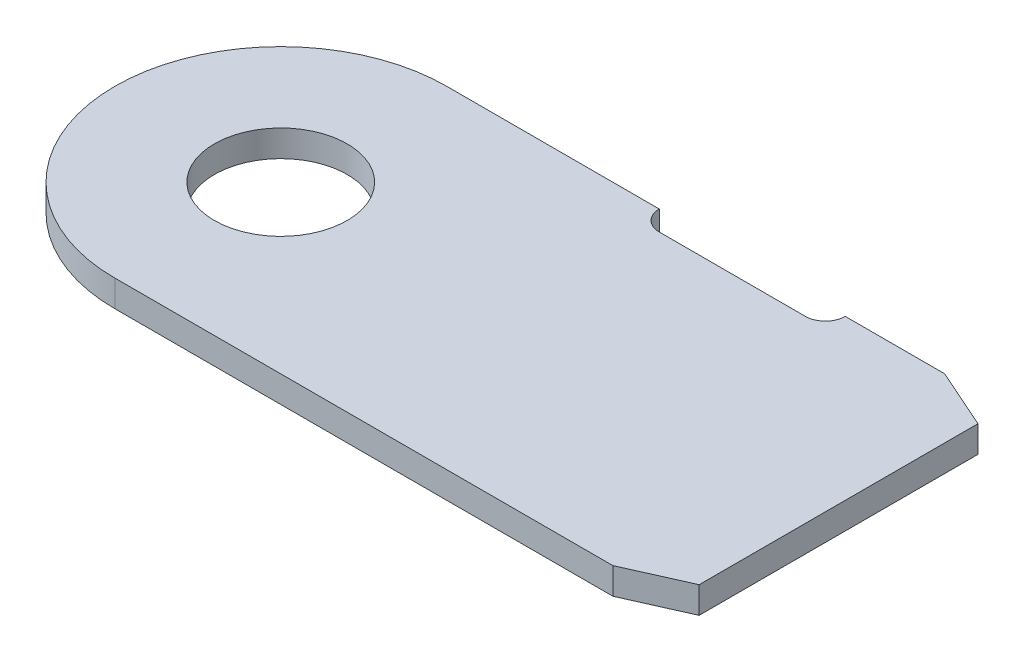
ISO-10303-21;
HEADER;
FILE_DESCRIPTION(('STEP AP214'),'2;1');
FILE_NAME('part.step','',(''),(''),'','','');
FILE_SCHEMA(('AUTOMOTIVE_DESIGN { 1 0 10303 214 1 1 1 1 }'));
ENDSEC;
DATA;
#1=APPLICATION_CONTEXT('core data for automotive mechanical design processes');
#2=APPLICATION_PROTOCOL_DEFINITION('international standard','automotive_design',2000,#1);
#3=PRODUCT_CONTEXT('',#1,'mechanical');
#4=PRODUCT('Part','Part','',(#3));
#5=PRODUCT_RELATED_PRODUCT_CATEGORY('part','',(#4));
#6=PRODUCT_DEFINITION_FORMATION('','',#4);
#7=PRODUCT_DEFINITION_CONTEXT('part definition',#1,'design');
#8=PRODUCT_DEFINITION('design','',#6,#7);
#9=PRODUCT_DEFINITION_SHAPE('','',#8);
#10=(LENGTH_UNIT() NAMED_UNIT(*) SI_UNIT(.MILLI.,.METRE.));
#11=(NAMED_UNIT(*) PLANE_ANGLE_UNIT() SI_UNIT($,.RADIAN.));
#12=(NAMED_UNIT(*) SI_UNIT($,.STERADIAN.) SOLID_ANGLE_UNIT());
#13=UNCERTAINTY_MEASURE_WITH_UNIT(LENGTH_MEASURE(1.E-05),#10,'distance_accuracy_value','');
#14=(GEOMETRIC_REPRESENTATION_CONTEXT(3) GLOBAL_UNCERTAINTY_ASSIGNED_CONTEXT((#13)) GLOBAL_UNIT_ASSIGNED_CONTEXT((#10,
#11,#12)) REPRESENTATION_CONTEXT('',''));
#15=CARTESIAN_POINT('',(0.,0.,0.));
#16=DIRECTION('',(0.,0.,1.));
#17=DIRECTION('',(1.,0.,0.));
#18=AXIS2_PLACEMENT_3D('',#15,#16,#17);
#19=CARTESIAN_POINT('',(-27.25,1.,-12.5));
#20=DIRECTION('',(0.,0.,1.));
#21=DIRECTION('',(1.,0.,0.));
#22=AXIS2_PLACEMENT_3D('',#19,#20,#21);
#23=PLANE('',#22);
#24=DIRECTION('',(0.,1.,0.));
#25=VECTOR('',#24,1.);
#26=CARTESIAN_POINT('',(15.25,-1.,-12.5));
#27=LINE('',#26,#25);
#28=CARTESIAN_POINT('',(15.25,-1.,-12.5));
#29=VERTEX_POINT('',#28);
#30=CARTESIAN_POINT('',(15.25,1.,-12.5));
#31=VERTEX_POINT('',#30);
#32=EDGE_CURVE('E175',#29,#31,#27,.T.);
#33=ORIENTED_EDGE('',*,*,#32,.T.);
#34=DIRECTION('',(-1.,0.,0.));
#35=VECTOR('',#34,1.);
#36=CARTESIAN_POINT('',(-27.25,1.,-12.5));
#37=LINE('',#36,#35);
#38=CARTESIAN_POINT('',(22.75,1.,-12.5));
#39=VERTEX_POINT('',#38);
#40=EDGE_CURVE('E241',#39,#31,#37,.T.);
#41=ORIENTED_EDGE('',*,*,#40,.F.);
#42=CARTESIAN_POINT('',(22.75,-1.2,-12.5));
#43=CARTESIAN_POINT('',(22.75,-0.4,-12.5));
#44=CARTESIAN_POINT('',(22.75,0.399999999999999,-12.5));
#45=CARTESIAN_POINT('',(22.75,1.2,-12.5));
#46=B_SPLINE_CURVE_WITH_KNOTS('',3,(#42,#43,#44,#45),.UNSPECIFIED.,.F.,.F.,(4,4),(-0.0022,
0.0002),.UNSPECIFIED.);
#47=CARTESIAN_POINT('',(22.75,-1.,-12.5));
#48=VERTEX_POINT('',#47);
#49=EDGE_CURVE('E488',#39,#48,#46,.F.);
#50=ORIENTED_EDGE('',*,*,#49,.T.);
#51=DIRECTION('',(-1.,0.,0.));
#52=VECTOR('',#51,1.);
#53=CARTESIAN_POINT('',(-27.25,-1.,-12.5));
#54=LINE('',#53,#52);
#55=EDGE_CURVE('E232',#48,#29,#54,.T.);
#56=ORIENTED_EDGE('',*,*,#55,.T.);
#57=EDGE_LOOP('',(#33,#41,#50,#56));
#58=FACE_BOUND('',#57,.T.);
#59=ADVANCED_FACE('F48',(#58),#23,.F.);
#60=CARTESIAN_POINT('',(27.25,1.2,10.5));
#61=CARTESIAN_POINT('',(27.25,0.4,10.5));
#62=CARTESIAN_POINT('',(27.25,-0.4,10.5));
#63=CARTESIAN_POINT('',(27.25,-1.2,10.5));
#64=CARTESIAN_POINT('',(22.75,1.2,12.5));
#65=CARTESIAN_POINT('',(22.75,0.4,12.5));
#66=CARTESIAN_POINT('',(22.75,-0.4,12.5));
#67=CARTESIAN_POINT('',(22.75,-1.2,12.5));
#68=B_SPLINE_SURFACE_WITH_KNOTS('',1,3,((#60,#61,#62,#63),(#64,#65,#66,#67)),.UNSPECIFIED.,.F.,
.F.,.F.,(2,2),(4,4),(0.,1.),(-0.0002,0.0022),.UNSPECIFIED.);
#69=CARTESIAN_POINT('',(27.25,-1.2,10.5));
#70=CARTESIAN_POINT('',(27.25,-0.4,10.5));
#71=CARTESIAN_POINT('',(27.25,0.4,10.5));
#72=CARTESIAN_POINT('',(27.25,1.2,10.5));
#73=B_SPLINE_CURVE_WITH_KNOTS('',3,(#69,#70,#71,#72),.UNSPECIFIED.,.F.,.F.,(4,4),(-0.0002,
0.0022),.UNSPECIFIED.);
#74=CARTESIAN_POINT('',(27.25,1.,10.5));
#75=VERTEX_POINT('',#74);
#76=CARTESIAN_POINT('',(27.25,-1.,10.5));
#77=VERTEX_POINT('',#76);
#78=EDGE_CURVE('E202',#75,#77,#73,.F.);
#79=CARTESIAN_POINT('',(27.25,1.,10.5));
#80=CARTESIAN_POINT('',(22.75,1.,12.5));
#81=B_SPLINE_CURVE_WITH_KNOTS('',1,(#79,#80),.UNSPECIFIED.,.F.,.F.,(2,2),(0.,1.),.UNSPECIFIED.);
#82=CARTESIAN_POINT('',(22.75,1.,12.5));
#83=VERTEX_POINT('',#82);
#84=EDGE_CURVE('E61',#83,#75,#81,.F.);
#85=CARTESIAN_POINT('',(22.75,1.2,12.5));
#86=CARTESIAN_POINT('',(22.75,0.4,12.5));
#87=CARTESIAN_POINT('',(22.75,-0.4,12.5));
#88=CARTESIAN_POINT('',(22.75,-1.2,12.5));
#89=B_SPLINE_CURVE_WITH_KNOTS('',3,(#85,#86,#87,#88),.UNSPECIFIED.,.F.,.F.,(4,4),(-0.0002,
0.0022),.UNSPECIFIED.);
#90=CARTESIAN_POINT('',(22.75,-1.,12.5));
#91=VERTEX_POINT('',#90);
#92=EDGE_CURVE('E279',#91,#83,#89,.F.);
#93=CARTESIAN_POINT('',(22.75,-1.,12.5));
#94=CARTESIAN_POINT('',(27.25,-1.,10.5));
#95=B_SPLINE_CURVE_WITH_KNOTS('',1,(#93,#94),.UNSPECIFIED.,.F.,.F.,(2,2),(0.,1.),.UNSPECIFIED.);
#96=EDGE_CURVE('E13',#77,#91,#95,.F.);
#97=ORIENTED_EDGE('',*,*,#78,.F.);
#98=ORIENTED_EDGE('',*,*,#84,.F.);
#99=ORIENTED_EDGE('',*,*,#92,.F.);
#100=ORIENTED_EDGE('',*,*,#96,.F.);
#101=EDGE_LOOP('',(#97,#98,#99,#100));
#102=FACE_BOUND('',#101,.T.);
#103=ADVANCED_FACE('F50',(#102),#68,.T.);
#104=CARTESIAN_POINT('',(27.25,-1.2,-10.5));
#105=CARTESIAN_POINT('',(27.25,-0.4,-10.5));
#106=CARTESIAN_POINT('',(27.25,0.399999999999999,-10.5));
#107=CARTESIAN_POINT('',(27.25,1.2,-10.5));
#108=CARTESIAN_POINT('',(22.75,-1.2,-12.5));
#109=CARTESIAN_POINT('',(22.75,-0.4,-12.5));
#110=CARTESIAN_POINT('',(22.75,0.399999999999999,-12.5));
#111=CARTESIAN_POINT('',(22.75,1.2,-12.5));
#112=B_SPLINE_SURFACE_WITH_KNOTS('',1,3,((#104,#105,#106,#107),(#108,#109,#110,#111)),
.UNSPECIFIED.,.F.,.F.,.F.,(2,2),(4,4),(0.,1.),(-0.0022,0.0002),.UNSPECIFIED.);
#113=CARTESIAN_POINT('',(27.25,1.2,-10.5));
#114=CARTESIAN_POINT('',(27.25,0.399999999999999,-10.5));
#115=CARTESIAN_POINT('',(27.25,-0.4,-10.5));
#116=CARTESIAN_POINT('',(27.25,-1.2,-10.5));
#117=B_SPLINE_CURVE_WITH_KNOTS('',3,(#113,#114,#115,#116),.UNSPECIFIED.,.F.,.F.,(4,4),(-0.0022,
0.0002),.UNSPECIFIED.);
#118=CARTESIAN_POINT('',(27.25,-1.,-10.5));
#119=VERTEX_POINT('',#118);
#120=CARTESIAN_POINT('',(27.25,1.,-10.5));
#121=VERTEX_POINT('',#120);
#122=EDGE_CURVE('E338',#119,#121,#117,.F.);
#123=CARTESIAN_POINT('',(27.25,-1.,-10.5));
#124=CARTESIAN_POINT('',(22.75,-1.,-12.5));
#125=B_SPLINE_CURVE_WITH_KNOTS('',1,(#123,#124),.UNSPECIFIED.,.F.,.F.,(2,2),(0.,1.),.UNSPECIFIED.);
#126=EDGE_CURVE('E490',#48,#119,#125,.F.);
#127=CARTESIAN_POINT('',(22.75,1.,-12.5));
#128=CARTESIAN_POINT('',(27.25,1.,-10.5));
#129=B_SPLINE_CURVE_WITH_KNOTS('',1,(#127,#128),.UNSPECIFIED.,.F.,.F.,(2,2),(0.,1.),.UNSPECIFIED.);
#130=EDGE_CURVE('E325',#121,#39,#129,.F.);
#131=ORIENTED_EDGE('',*,*,#122,.F.);
#132=ORIENTED_EDGE('',*,*,#126,.F.);
#133=ORIENTED_EDGE('',*,*,#49,.F.);
#134=ORIENTED_EDGE('',*,*,#130,.F.);
#135=EDGE_LOOP('',(#131,#132,#133,#134));
#136=FACE_BOUND('',#135,.T.);
#137=ADVANCED_FACE('F343',(#136),#112,.T.);
#138=CARTESIAN_POINT('',(-14.75,-1.,0.));
#139=DIRECTION('',(0.,-1.,0.));
#140=DIRECTION('',(0.,0.,-1.));
#141=AXIS2_PLACEMENT_3D('',#138,#139,#140);
#142=CYLINDRICAL_SURFACE('',#141,12.5);
#143=DIRECTION('',(0.,-1.,0.));
#144=VECTOR('',#143,1.);
#145=CARTESIAN_POINT('',(-14.75,1.,-12.5));
#146=LINE('',#145,#144);
#147=CARTESIAN_POINT('',(-14.75,-1.,-12.5));
#148=VERTEX_POINT('',#147);
#149=CARTESIAN_POINT('',(-14.75,1.,-12.5));
#150=VERTEX_POINT('',#149);
#151=EDGE_CURVE('E500',#148,#150,#146,.F.);
#152=ORIENTED_EDGE('',*,*,#151,.F.);
#153=CARTESIAN_POINT('',(-14.75,-1.,0.));
#154=DIRECTION('',(0.,-1.,0.));
#155=DIRECTION('',(0.,0.,-1.));
#156=AXIS2_PLACEMENT_3D('',#153,#154,#155);
#157=CIRCLE('',#156,12.5);
#158=CARTESIAN_POINT('',(-14.75,-1.,12.5));
#159=VERTEX_POINT('',#158);
#160=EDGE_CURVE('E492',#159,#148,#157,.T.);
#161=ORIENTED_EDGE('',*,*,#160,.F.);
#162=DIRECTION('',(0.,-1.,0.));
#163=VECTOR('',#162,1.);
#164=CARTESIAN_POINT('',(-14.75,1.,12.5));
#165=LINE('',#164,#163);
#166=CARTESIAN_POINT('',(-14.75,1.,12.5));
#167=VERTEX_POINT('',#166);
#168=EDGE_CURVE('E496',#167,#159,#165,.T.);
#169=ORIENTED_EDGE('',*,*,#168,.F.);
#170=CARTESIAN_POINT('',(-14.75,1.,0.));
#171=DIRECTION('',(0.,-1.,0.));
#172=DIRECTION('',(0.,0.,-1.));
#173=AXIS2_PLACEMENT_3D('',#170,#171,#172);
#174=CIRCLE('',#173,12.5);
#175=EDGE_CURVE('E491',#150,#167,#174,.F.);
#176=ORIENTED_EDGE('',*,*,#175,.F.);
#177=EDGE_LOOP('',(#152,#161,#169,#176));
#178=FACE_BOUND('',#177,.T.);
#179=ADVANCED_FACE('F220',(#178),#142,.T.);
#180=CARTESIAN_POINT('',(27.25,1.,12.5));
#181=DIRECTION('',(-1.,0.,0.));
#182=DIRECTION('',(0.,0.,1.));
#183=AXIS2_PLACEMENT_3D('',#180,#181,#182);
#184=PLANE('',#183);
#185=DIRECTION('',(0.,0.,-1.));
#186=VECTOR('',#185,1.);
#187=CARTESIAN_POINT('',(27.25,1.,12.5));
#188=LINE('',#187,#186);
#189=EDGE_CURVE('E191',#75,#121,#188,.T.);
#190=ORIENTED_EDGE('',*,*,#189,.F.);
#191=ORIENTED_EDGE('',*,*,#78,.T.);
#192=DIRECTION('',(0.,0.,-1.));
#193=VECTOR('',#192,1.);
#194=CARTESIAN_POINT('',(27.25,-1.,12.5));
#195=LINE('',#194,#193);
#196=EDGE_CURVE('E184',#77,#119,#195,.T.);
#197=ORIENTED_EDGE('',*,*,#196,.T.);
#198=ORIENTED_EDGE('',*,*,#122,.T.);
#199=EDGE_LOOP('',(#190,#191,#197,#198));
#200=FACE_BOUND('',#199,.T.);
#201=ADVANCED_FACE('F209',(#200),#184,.F.);
#202=CARTESIAN_POINT('',(1.24999999999998,1.,-12.5));
#203=VERTEX_POINT('',#202);
#204=EDGE_CURVE('E55',#203,#150,#37,.T.);
#205=ORIENTED_EDGE('',*,*,#204,.F.);
#206=DIRECTION('',(0.,1.,0.));
#207=VECTOR('',#206,1.);
#208=CARTESIAN_POINT('',(1.24999999999998,-1.,-12.5));
#209=LINE('',#208,#207);
#210=CARTESIAN_POINT('',(1.24999999999998,-1.,-12.5));
#211=VERTEX_POINT('',#210);
#212=EDGE_CURVE('E172',#211,#203,#209,.T.);
#213=ORIENTED_EDGE('',*,*,#212,.F.);
#214=EDGE_CURVE('E158',#211,#148,#54,.T.);
#215=ORIENTED_EDGE('',*,*,#214,.T.);
#216=ORIENTED_EDGE('',*,*,#151,.T.);
#217=EDGE_LOOP('',(#205,#213,#215,#216));
#218=FACE_BOUND('',#217,.T.);
#219=ADVANCED_FACE('F219',(#218),#23,.F.);
#220=CARTESIAN_POINT('',(-27.25,1.,12.5));
#221=DIRECTION('',(0.,0.,-1.));
#222=DIRECTION('',(-1.,0.,0.));
#223=AXIS2_PLACEMENT_3D('',#220,#221,#222);
#224=PLANE('',#223);
#225=DIRECTION('',(1.,0.,0.));
#226=VECTOR('',#225,1.);
#227=CARTESIAN_POINT('',(-27.25,-1.,12.5));
#228=LINE('',#227,#226);
#229=EDGE_CURVE('E194',#159,#91,#228,.T.);
#230=ORIENTED_EDGE('',*,*,#229,.T.);
#231=ORIENTED_EDGE('',*,*,#92,.T.);
#232=DIRECTION('',(1.,0.,0.));
#233=VECTOR('',#232,1.);
#234=CARTESIAN_POINT('',(-27.25,1.,12.5));
#235=LINE('',#234,#233);
#236=EDGE_CURVE('E207',#167,#83,#235,.T.);
#237=ORIENTED_EDGE('',*,*,#236,.F.);
#238=ORIENTED_EDGE('',*,*,#168,.T.);
#239=EDGE_LOOP('',(#230,#231,#237,#238));
#240=FACE_BOUND('',#239,.T.);
#241=ADVANCED_FACE('F306',(#240),#224,.F.);
#242=CARTESIAN_POINT('',(0.,1.,0.));
#243=DIRECTION('',(0.,-1.,0.));
#244=DIRECTION('',(0.,0.,-1.));
#245=AXIS2_PLACEMENT_3D('',#242,#243,#244);
#246=PLANE('',#245);
#247=DIRECTION('',(-1.,0.,0.));
#248=VECTOR('',#247,1.);
#249=CARTESIAN_POINT('',(0.,1.,-11.));
#250=LINE('',#249,#248);
#251=CARTESIAN_POINT('',(13.7548742239803,1.,-11.));
#252=VERTEX_POINT('',#251);
#253=CARTESIAN_POINT('',(2.74999999999998,1.,-11.));
#254=VERTEX_POINT('',#253);
#255=EDGE_CURVE('E168',#252,#254,#250,.T.);
#256=ORIENTED_EDGE('',*,*,#255,.T.);
#257=CARTESIAN_POINT('',(2.74999999999998,1.,-12.5));
#258=DIRECTION('',(0.,1.,0.));
#259=DIRECTION('',(0.,0.,1.));
#260=AXIS2_PLACEMENT_3D('',#257,#258,#259);
#261=CIRCLE('',#260,1.5);
#262=EDGE_CURVE('E150',#203,#254,#261,.T.);
#263=ORIENTED_EDGE('',*,*,#262,.F.);
#264=ORIENTED_EDGE('',*,*,#204,.T.);
#265=ORIENTED_EDGE('',*,*,#175,.T.);
#266=ORIENTED_EDGE('',*,*,#236,.T.);
#267=ORIENTED_EDGE('',*,*,#84,.T.);
#268=ORIENTED_EDGE('',*,*,#189,.T.);
#269=ORIENTED_EDGE('',*,*,#130,.T.);
#270=ORIENTED_EDGE('',*,*,#40,.T.);
#271=DIRECTION('',(0.,0.,1.));
#272=VECTOR('',#271,1.);
#273=CARTESIAN_POINT('',(15.25,1.,0.));
#274=LINE('',#273,#272);
#275=CARTESIAN_POINT('',(15.25,1.,-12.3791740347375));
#276=VERTEX_POINT('',#275);
#277=EDGE_CURVE('E159',#31,#276,#274,.T.);
#278=ORIENTED_EDGE('',*,*,#277,.T.);
#279=CARTESIAN_POINT('',(13.7548742239803,1.,-12.5));
#280=DIRECTION('',(0.,1.,0.));
#281=DIRECTION('',(0.,0.,1.));
#282=AXIS2_PLACEMENT_3D('',#279,#280,#281);
#283=CIRCLE('',#282,1.5);
#284=EDGE_CURVE('E162',#252,#276,#283,.T.);
#285=ORIENTED_EDGE('',*,*,#284,.F.);
#286=EDGE_LOOP('',(#256,#263,#264,#265,#266,#267,#268,#269,#270,#278,#285));
#287=FACE_BOUND('',#286,.T.);
#288=CARTESIAN_POINT('',(-14.75,1.,0.));
#289=DIRECTION('',(0.,1.,0.));
#290=DIRECTION('',(0.,0.,1.));
#291=AXIS2_PLACEMENT_3D('',#288,#289,#290);
#292=CIRCLE('',#291,5.);
#293=CARTESIAN_POINT('',(-14.75,1.,5.));
#294=VERTEX_POINT('',#293);
#295=EDGE_CURVE('E174',#294,#294,#292,.T.);
#296=ORIENTED_EDGE('',*,*,#295,.F.);
#297=EDGE_LOOP('',(#296));
#298=FACE_BOUND('',#297,.T.);
#299=ADVANCED_FACE('F303',(#287,#298),#246,.F.);
#300=CARTESIAN_POINT('',(0.,-1.,0.));
#301=DIRECTION('',(0.,-1.,0.));
#302=DIRECTION('',(0.,0.,-1.));
#303=AXIS2_PLACEMENT_3D('',#300,#301,#302);
#304=PLANE('',#303);
#305=CARTESIAN_POINT('',(2.74999999999998,-1.,-12.5));
#306=DIRECTION('',(0.,1.,0.));
#307=DIRECTION('',(0.,0.,1.));
#308=AXIS2_PLACEMENT_3D('',#305,#306,#307);
#309=CIRCLE('',#308,1.5);
#310=CARTESIAN_POINT('',(2.74999999999998,-1.,-11.));
#311=VERTEX_POINT('',#310);
#312=EDGE_CURVE('E144',#211,#311,#309,.T.);
#313=ORIENTED_EDGE('',*,*,#312,.T.);
#314=DIRECTION('',(-1.,0.,0.));
#315=VECTOR('',#314,1.);
#316=CARTESIAN_POINT('',(0.,-1.,-11.));
#317=LINE('',#316,#315);
#318=CARTESIAN_POINT('',(13.7548742239803,-1.,-11.));
#319=VERTEX_POINT('',#318);
#320=EDGE_CURVE('E136',#319,#311,#317,.T.);
#321=ORIENTED_EDGE('',*,*,#320,.F.);
#322=CARTESIAN_POINT('',(13.7548742239803,-1.,-12.5));
#323=DIRECTION('',(0.,1.,0.));
#324=DIRECTION('',(0.,0.,1.));
#325=AXIS2_PLACEMENT_3D('',#322,#323,#324);
#326=CIRCLE('',#325,1.5);
#327=CARTESIAN_POINT('',(15.25,-1.,-12.3791740347375));
#328=VERTEX_POINT('',#327);
#329=EDGE_CURVE('E68',#319,#328,#326,.T.);
#330=ORIENTED_EDGE('',*,*,#329,.T.);
#331=DIRECTION('',(0.,0.,1.));
#332=VECTOR('',#331,1.);
#333=CARTESIAN_POINT('',(15.25,-1.,0.));
#334=LINE('',#333,#332);
#335=EDGE_CURVE('E152',#29,#328,#334,.T.);
#336=ORIENTED_EDGE('',*,*,#335,.F.);
#337=ORIENTED_EDGE('',*,*,#55,.F.);
#338=ORIENTED_EDGE('',*,*,#126,.T.);
#339=ORIENTED_EDGE('',*,*,#196,.F.);
#340=ORIENTED_EDGE('',*,*,#96,.T.);
#341=ORIENTED_EDGE('',*,*,#229,.F.);
#342=ORIENTED_EDGE('',*,*,#160,.T.);
#343=ORIENTED_EDGE('',*,*,#214,.F.);
#344=EDGE_LOOP('',(#313,#321,#330,#336,#337,#338,#339,#340,#341,#342,#343));
#345=FACE_BOUND('',#344,.T.);
#346=CARTESIAN_POINT('',(-14.75,-1.,0.));
#347=DIRECTION('',(0.,1.,0.));
#348=DIRECTION('',(0.,0.,1.));
#349=AXIS2_PLACEMENT_3D('',#346,#347,#348);
#350=CIRCLE('',#349,5.);
#351=CARTESIAN_POINT('',(-14.75,-1.,5.));
#352=VERTEX_POINT('',#351);
#353=EDGE_CURVE('E181',#352,#352,#350,.T.);
#354=ORIENTED_EDGE('',*,*,#353,.T.);
#355=EDGE_LOOP('',(#354));
#356=FACE_BOUND('',#355,.T.);
#357=ADVANCED_FACE('F155',(#345,#356),#304,.T.);
#358=CARTESIAN_POINT('',(-14.75,-1.,0.));
#359=DIRECTION('',(0.,1.,0.));
#360=DIRECTION('',(0.,0.,1.));
#361=AXIS2_PLACEMENT_3D('',#358,#359,#360);
#362=CYLINDRICAL_SURFACE('',#361,5.);
#363=ORIENTED_EDGE('',*,*,#353,.F.);
#364=EDGE_LOOP('',(#363));
#365=FACE_BOUND('',#364,.T.);
#366=ORIENTED_EDGE('',*,*,#295,.T.);
#367=EDGE_LOOP('',(#366));
#368=FACE_BOUND('',#367,.T.);
#369=ADVANCED_FACE('F302',(#365,#368),#362,.F.);
#370=CARTESIAN_POINT('',(2.74999999999998,-1.,-12.5));
#371=DIRECTION('',(0.,1.,0.));
#372=DIRECTION('',(0.,0.,1.));
#373=AXIS2_PLACEMENT_3D('',#370,#371,#372);
#374=CYLINDRICAL_SURFACE('',#373,1.5);
#375=ORIENTED_EDGE('',*,*,#262,.T.);
#376=DIRECTION('',(0.,1.,0.));
#377=VECTOR('',#376,1.);
#378=CARTESIAN_POINT('',(2.74999999999998,-1.,-11.));
#379=LINE('',#378,#377);
#380=EDGE_CURVE('E140',#311,#254,#379,.T.);
#381=ORIENTED_EDGE('',*,*,#380,.F.);
#382=ORIENTED_EDGE('',*,*,#312,.F.);
#383=ORIENTED_EDGE('',*,*,#212,.T.);
#384=EDGE_LOOP('',(#375,#381,#382,#383));
#385=FACE_BOUND('',#384,.T.);
#386=ADVANCED_FACE('F147',(#385),#374,.F.);
#387=CARTESIAN_POINT('',(15.25,-1.,0.));
#388=DIRECTION('',(-1.,0.,0.));
#389=DIRECTION('',(0.,0.,1.));
#390=AXIS2_PLACEMENT_3D('',#387,#388,#389);
#391=PLANE('',#390);
#392=ORIENTED_EDGE('',*,*,#277,.F.);
#393=ORIENTED_EDGE('',*,*,#32,.F.);
#394=ORIENTED_EDGE('',*,*,#335,.T.);
#395=DIRECTION('',(0.,1.,0.));
#396=VECTOR('',#395,1.);
#397=CARTESIAN_POINT('',(15.25,-1.,-12.3791740347375));
#398=LINE('',#397,#396);
#399=EDGE_CURVE('E178',#328,#276,#398,.T.);
#400=ORIENTED_EDGE('',*,*,#399,.T.);
#401=EDGE_LOOP('',(#392,#393,#394,#400));
#402=FACE_BOUND('',#401,.T.);
#403=ADVANCED_FACE('F539',(#402),#391,.T.);
#404=CARTESIAN_POINT('',(13.7548742239803,-1.,-12.5));
#405=DIRECTION('',(0.,1.,0.));
#406=DIRECTION('',(0.,0.,1.));
#407=AXIS2_PLACEMENT_3D('',#404,#405,#406);
#408=CYLINDRICAL_SURFACE('',#407,1.5);
#409=ORIENTED_EDGE('',*,*,#284,.T.);
#410=ORIENTED_EDGE('',*,*,#399,.F.);
#411=ORIENTED_EDGE('',*,*,#329,.F.);
#412=DIRECTION('',(0.,1.,0.));
#413=VECTOR('',#412,1.);
#414=CARTESIAN_POINT('',(13.7548742239803,-1.,-11.));
#415=LINE('',#414,#413);
#416=EDGE_CURVE('E142',#319,#252,#415,.T.);
#417=ORIENTED_EDGE('',*,*,#416,.T.);
#418=EDGE_LOOP('',(#409,#410,#411,#417));
#419=FACE_BOUND('',#418,.T.);
#420=ADVANCED_FACE('F548',(#419),#408,.F.);
#421=CARTESIAN_POINT('',(0.,-1.,-11.));
#422=DIRECTION('',(0.,0.,-1.));
#423=DIRECTION('',(-1.,0.,0.));
#424=AXIS2_PLACEMENT_3D('',#421,#422,#423);
#425=PLANE('',#424);
#426=ORIENTED_EDGE('',*,*,#255,.F.);
#427=ORIENTED_EDGE('',*,*,#416,.F.);
#428=ORIENTED_EDGE('',*,*,#320,.T.);
#429=ORIENTED_EDGE('',*,*,#380,.T.);
#430=EDGE_LOOP('',(#426,#427,#428,#429));
#431=FACE_BOUND('',#430,.T.);
#432=ADVANCED_FACE('F139',(#431),#425,.T.);
#433=CLOSED_SHELL('',(#59,#103,#137,#179,#201,#219,#241,#299,#357,#369,#386,#403,#420,#432));
#434=MANIFOLD_SOLID_BREP('B2',#433);
#435=ADVANCED_BREP_SHAPE_REPRESENTATION('',(#18,#434),#14);
#436=SHAPE_DEFINITION_REPRESENTATION(#9,#435);
ENDSEC;
END-ISO-10303-21;
